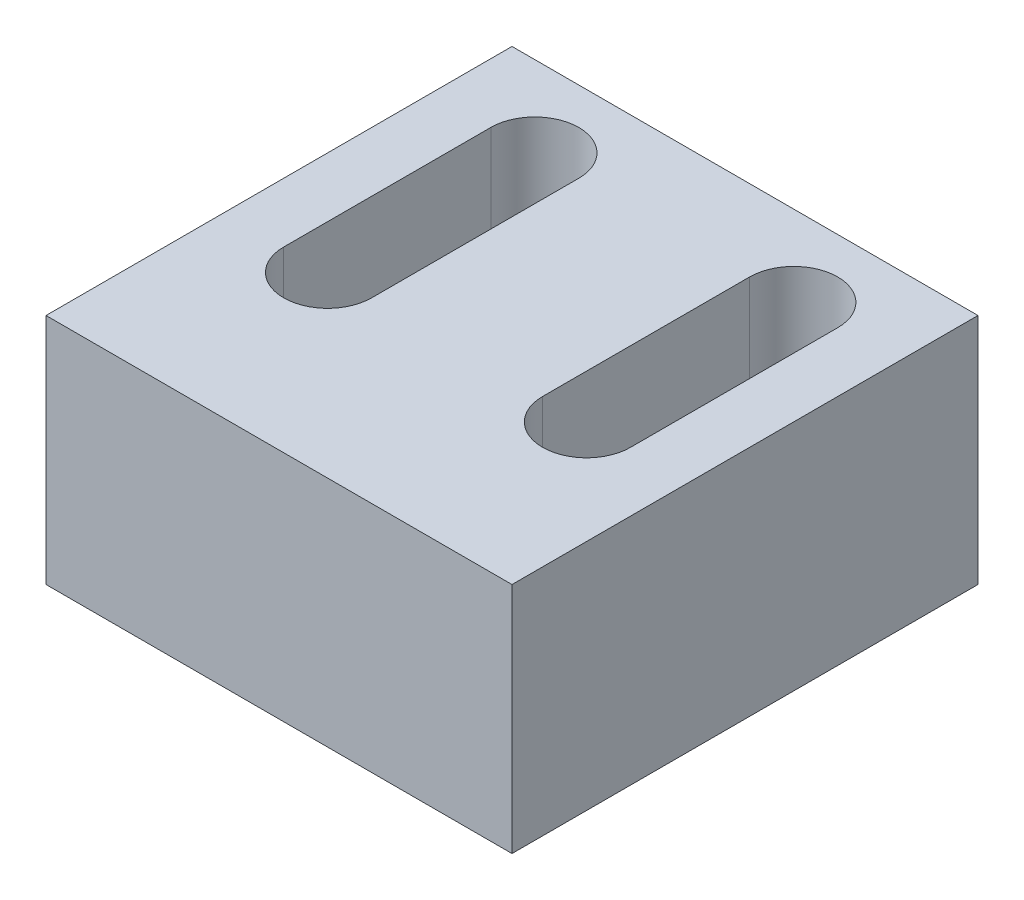
ISO-10303-21;
HEADER;
FILE_DESCRIPTION(('STEP AP214'),'2;1');
FILE_NAME('part.step','',(''),(''),'','','');
FILE_SCHEMA(('AUTOMOTIVE_DESIGN { 1 0 10303 214 1 1 1 1 }'));
ENDSEC;
DATA;
#1=APPLICATION_CONTEXT('core data for automotive mechanical design processes');
#2=APPLICATION_PROTOCOL_DEFINITION('international standard','automotive_design',2000,#1);
#3=PRODUCT_CONTEXT('',#1,'mechanical');
#4=PRODUCT('Part','Part','',(#3));
#5=PRODUCT_RELATED_PRODUCT_CATEGORY('part','',(#4));
#6=PRODUCT_DEFINITION_FORMATION('','',#4);
#7=PRODUCT_DEFINITION_CONTEXT('part definition',#1,'design');
#8=PRODUCT_DEFINITION('design','',#6,#7);
#9=PRODUCT_DEFINITION_SHAPE('','',#8);
#10=(LENGTH_UNIT() NAMED_UNIT(*) SI_UNIT(.MILLI.,.METRE.));
#11=(NAMED_UNIT(*) PLANE_ANGLE_UNIT() SI_UNIT($,.RADIAN.));
#12=(NAMED_UNIT(*) SI_UNIT($,.STERADIAN.) SOLID_ANGLE_UNIT());
#13=UNCERTAINTY_MEASURE_WITH_UNIT(LENGTH_MEASURE(1.E-05),#10,'distance_accuracy_value','');
#14=(GEOMETRIC_REPRESENTATION_CONTEXT(3) GLOBAL_UNCERTAINTY_ASSIGNED_CONTEXT((#13)) GLOBAL_UNIT_ASSIGNED_CONTEXT((#10,
#11,#12)) REPRESENTATION_CONTEXT('',''));
#15=CARTESIAN_POINT('',(0.,0.,0.));
#16=DIRECTION('',(0.,0.,1.));
#17=DIRECTION('',(1.,0.,0.));
#18=AXIS2_PLACEMENT_3D('',#15,#16,#17);
#19=CARTESIAN_POINT('',(22.5,11.25,-22.5));
#20=DIRECTION('',(0.,0.,1.));
#21=DIRECTION('',(0.,-1.,0.));
#22=AXIS2_PLACEMENT_3D('',#19,#20,#21);
#23=PLANE('',#22);
#24=DIRECTION('',(0.,1.,0.));
#25=VECTOR('',#24,1.);
#26=CARTESIAN_POINT('',(-22.5,11.25,-22.5));
#27=LINE('',#26,#25);
#28=CARTESIAN_POINT('',(-22.5,-11.25,-22.5));
#29=VERTEX_POINT('',#28);
#30=CARTESIAN_POINT('',(-22.5,11.25,-22.5));
#31=VERTEX_POINT('',#30);
#32=EDGE_CURVE('E163',#29,#31,#27,.T.);
#33=ORIENTED_EDGE('',*,*,#32,.T.);
#34=DIRECTION('',(-1.,0.,0.));
#35=VECTOR('',#34,1.);
#36=CARTESIAN_POINT('',(22.5,11.25,-22.5));
#37=LINE('',#36,#35);
#38=CARTESIAN_POINT('',(22.5,11.25,-22.5));
#39=VERTEX_POINT('',#38);
#40=EDGE_CURVE('E231',#39,#31,#37,.T.);
#41=ORIENTED_EDGE('',*,*,#40,.F.);
#42=DIRECTION('',(0.,1.,0.));
#43=VECTOR('',#42,1.);
#44=CARTESIAN_POINT('',(22.5,11.25,-22.5));
#45=LINE('',#44,#43);
#46=CARTESIAN_POINT('',(22.5,-11.25,-22.5));
#47=VERTEX_POINT('',#46);
#48=EDGE_CURVE('E194',#47,#39,#45,.T.);
#49=ORIENTED_EDGE('',*,*,#48,.F.);
#50=DIRECTION('',(-1.,0.,0.));
#51=VECTOR('',#50,1.);
#52=CARTESIAN_POINT('',(22.5,-11.25,-22.5));
#53=LINE('',#52,#51);
#54=EDGE_CURVE('E208',#47,#29,#53,.T.);
#55=ORIENTED_EDGE('',*,*,#54,.T.);
#56=EDGE_LOOP('',(#33,#41,#49,#55));
#57=FACE_BOUND('',#56,.T.);
#58=ADVANCED_FACE('F38',(#57),#23,.F.);
#59=CARTESIAN_POINT('',(22.5,11.25,22.5));
#60=DIRECTION('',(0.,-1.,0.));
#61=DIRECTION('',(0.,0.,-1.));
#62=AXIS2_PLACEMENT_3D('',#59,#60,#61);
#63=PLANE('',#62);
#64=DIRECTION('',(0.,0.,1.));
#65=VECTOR('',#64,1.);
#66=CARTESIAN_POINT('',(-16.75,11.25,-14.7));
#67=LINE('',#66,#65);
#68=CARTESIAN_POINT('',(-16.75,11.25,-14.7));
#69=VERTEX_POINT('',#68);
#70=CARTESIAN_POINT('',(-16.75,11.25,5.3));
#71=VERTEX_POINT('',#70);
#72=EDGE_CURVE('E145',#69,#71,#67,.T.);
#73=ORIENTED_EDGE('',*,*,#72,.F.);
#74=CARTESIAN_POINT('',(-12.5,11.25,-14.7));
#75=DIRECTION('',(0.,1.,0.));
#76=DIRECTION('',(0.,0.,1.));
#77=AXIS2_PLACEMENT_3D('',#74,#75,#76);
#78=CIRCLE('',#77,4.25);
#79=CARTESIAN_POINT('',(-8.25,11.25,-14.7));
#80=VERTEX_POINT('',#79);
#81=EDGE_CURVE('E53',#80,#69,#78,.T.);
#82=ORIENTED_EDGE('',*,*,#81,.F.);
#83=DIRECTION('',(0.,0.,-1.));
#84=VECTOR('',#83,1.);
#85=CARTESIAN_POINT('',(-8.25,11.25,-14.7));
#86=LINE('',#85,#84);
#87=CARTESIAN_POINT('',(-8.25,11.25,5.3));
#88=VERTEX_POINT('',#87);
#89=EDGE_CURVE('E153',#88,#80,#86,.T.);
#90=ORIENTED_EDGE('',*,*,#89,.F.);
#91=CARTESIAN_POINT('',(-12.5,11.25,5.3));
#92=DIRECTION('',(0.,1.,0.));
#93=DIRECTION('',(0.,0.,1.));
#94=AXIS2_PLACEMENT_3D('',#91,#92,#93);
#95=CIRCLE('',#94,4.25);
#96=EDGE_CURVE('E134',#71,#88,#95,.T.);
#97=ORIENTED_EDGE('',*,*,#96,.F.);
#98=EDGE_LOOP('',(#73,#82,#90,#97));
#99=FACE_BOUND('',#98,.T.);
#100=DIRECTION('',(0.,0.,1.));
#101=VECTOR('',#100,1.);
#102=CARTESIAN_POINT('',(8.25,11.25,-14.7));
#103=LINE('',#102,#101);
#104=CARTESIAN_POINT('',(8.25,11.25,-14.7));
#105=VERTEX_POINT('',#104);
#106=CARTESIAN_POINT('',(8.25,11.25,5.3));
#107=VERTEX_POINT('',#106);
#108=EDGE_CURVE('E170',#105,#107,#103,.T.);
#109=ORIENTED_EDGE('',*,*,#108,.F.);
#110=CARTESIAN_POINT('',(12.5,11.25,-14.7));
#111=DIRECTION('',(0.,1.,0.));
#112=DIRECTION('',(0.,0.,-1.));
#113=AXIS2_PLACEMENT_3D('',#110,#111,#112);
#114=CIRCLE('',#113,4.25);
#115=CARTESIAN_POINT('',(16.75,11.25,-14.7));
#116=VERTEX_POINT('',#115);
#117=EDGE_CURVE('E61',#116,#105,#114,.T.);
#118=ORIENTED_EDGE('',*,*,#117,.F.);
#119=DIRECTION('',(0.,0.,-1.));
#120=VECTOR('',#119,1.);
#121=CARTESIAN_POINT('',(16.75,11.25,-14.7));
#122=LINE('',#121,#120);
#123=CARTESIAN_POINT('',(16.75,11.25,5.3));
#124=VERTEX_POINT('',#123);
#125=EDGE_CURVE('E178',#124,#116,#122,.T.);
#126=ORIENTED_EDGE('',*,*,#125,.F.);
#127=CARTESIAN_POINT('',(12.5,11.25,5.3));
#128=DIRECTION('',(0.,1.,0.));
#129=DIRECTION('',(0.,0.,-1.));
#130=AXIS2_PLACEMENT_3D('',#127,#128,#129);
#131=CIRCLE('',#130,4.25);
#132=EDGE_CURVE('E174',#107,#124,#131,.T.);
#133=ORIENTED_EDGE('',*,*,#132,.F.);
#134=EDGE_LOOP('',(#109,#118,#126,#133));
#135=FACE_BOUND('',#134,.T.);
#136=DIRECTION('',(0.,0.,1.));
#137=VECTOR('',#136,1.);
#138=CARTESIAN_POINT('',(-22.5,11.25,22.5));
#139=LINE('',#138,#137);
#140=CARTESIAN_POINT('',(-22.5,11.25,22.5));
#141=VERTEX_POINT('',#140);
#142=EDGE_CURVE('E212',#31,#141,#139,.T.);
#143=ORIENTED_EDGE('',*,*,#142,.T.);
#144=DIRECTION('',(-1.,0.,0.));
#145=VECTOR('',#144,1.);
#146=CARTESIAN_POINT('',(22.5,11.25,22.5));
#147=LINE('',#146,#145);
#148=CARTESIAN_POINT('',(22.5,11.25,22.5));
#149=VERTEX_POINT('',#148);
#150=EDGE_CURVE('E227',#149,#141,#147,.T.);
#151=ORIENTED_EDGE('',*,*,#150,.F.);
#152=DIRECTION('',(0.,0.,1.));
#153=VECTOR('',#152,1.);
#154=CARTESIAN_POINT('',(22.5,11.25,22.5));
#155=LINE('',#154,#153);
#156=EDGE_CURVE('E198',#39,#149,#155,.T.);
#157=ORIENTED_EDGE('',*,*,#156,.F.);
#158=ORIENTED_EDGE('',*,*,#40,.T.);
#159=EDGE_LOOP('',(#143,#151,#157,#158));
#160=FACE_BOUND('',#159,.T.);
#161=ADVANCED_FACE('F150',(#99,#135,#160),#63,.F.);
#162=CARTESIAN_POINT('',(22.5,11.25,22.5));
#163=DIRECTION('',(0.,0.,-1.));
#164=DIRECTION('',(0.,1.,0.));
#165=AXIS2_PLACEMENT_3D('',#162,#163,#164);
#166=PLANE('',#165);
#167=DIRECTION('',(0.,-1.,0.));
#168=VECTOR('',#167,1.);
#169=CARTESIAN_POINT('',(-22.5,11.25,22.5));
#170=LINE('',#169,#168);
#171=CARTESIAN_POINT('',(-22.5,-11.25,22.5));
#172=VERTEX_POINT('',#171);
#173=EDGE_CURVE('E215',#141,#172,#170,.T.);
#174=ORIENTED_EDGE('',*,*,#173,.T.);
#175=DIRECTION('',(-1.,0.,0.));
#176=VECTOR('',#175,1.);
#177=CARTESIAN_POINT('',(22.5,-11.25,22.5));
#178=LINE('',#177,#176);
#179=CARTESIAN_POINT('',(22.5,-11.25,22.5));
#180=VERTEX_POINT('',#179);
#181=EDGE_CURVE('E223',#180,#172,#178,.T.);
#182=ORIENTED_EDGE('',*,*,#181,.F.);
#183=DIRECTION('',(0.,-1.,0.));
#184=VECTOR('',#183,1.);
#185=CARTESIAN_POINT('',(22.5,11.25,22.5));
#186=LINE('',#185,#184);
#187=EDGE_CURVE('E202',#149,#180,#186,.T.);
#188=ORIENTED_EDGE('',*,*,#187,.F.);
#189=ORIENTED_EDGE('',*,*,#150,.T.);
#190=EDGE_LOOP('',(#174,#182,#188,#189));
#191=FACE_BOUND('',#190,.T.);
#192=ADVANCED_FACE('F282',(#191),#166,.F.);
#193=CARTESIAN_POINT('',(22.5,-11.25,22.5));
#194=DIRECTION('',(0.,1.,0.));
#195=DIRECTION('',(0.,0.,1.));
#196=AXIS2_PLACEMENT_3D('',#193,#194,#195);
#197=PLANE('',#196);
#198=DIRECTION('',(0.,0.,-1.));
#199=VECTOR('',#198,1.);
#200=CARTESIAN_POINT('',(-8.25,-11.25,22.5));
#201=LINE('',#200,#199);
#202=CARTESIAN_POINT('',(-8.25,-11.25,5.3));
#203=VERTEX_POINT('',#202);
#204=CARTESIAN_POINT('',(-8.25,-11.25,-14.7));
#205=VERTEX_POINT('',#204);
#206=EDGE_CURVE('E46',#203,#205,#201,.T.);
#207=ORIENTED_EDGE('',*,*,#206,.T.);
#208=CARTESIAN_POINT('',(-12.5,-11.25,-14.7));
#209=DIRECTION('',(0.,1.,0.));
#210=DIRECTION('',(0.,0.,1.));
#211=AXIS2_PLACEMENT_3D('',#208,#209,#210);
#212=CIRCLE('',#211,4.25);
#213=CARTESIAN_POINT('',(-16.75,-11.25,-14.7));
#214=VERTEX_POINT('',#213);
#215=EDGE_CURVE('E11',#205,#214,#212,.T.);
#216=ORIENTED_EDGE('',*,*,#215,.T.);
#217=DIRECTION('',(0.,0.,1.));
#218=VECTOR('',#217,1.);
#219=CARTESIAN_POINT('',(-16.75,-11.25,22.5));
#220=LINE('',#219,#218);
#221=CARTESIAN_POINT('',(-16.75,-11.25,5.3));
#222=VERTEX_POINT('',#221);
#223=EDGE_CURVE('E251',#214,#222,#220,.T.);
#224=ORIENTED_EDGE('',*,*,#223,.T.);
#225=CARTESIAN_POINT('',(-12.5,-11.25,5.3));
#226=DIRECTION('',(0.,1.,0.));
#227=DIRECTION('',(0.,0.,1.));
#228=AXIS2_PLACEMENT_3D('',#225,#226,#227);
#229=CIRCLE('',#228,4.25);
#230=EDGE_CURVE('E137',#222,#203,#229,.T.);
#231=ORIENTED_EDGE('',*,*,#230,.T.);
#232=EDGE_LOOP('',(#207,#216,#224,#231));
#233=FACE_BOUND('',#232,.T.);
#234=DIRECTION('',(0.,0.,-1.));
#235=VECTOR('',#234,1.);
#236=CARTESIAN_POINT('',(16.75,-11.25,22.5));
#237=LINE('',#236,#235);
#238=CARTESIAN_POINT('',(16.75,-11.25,5.3));
#239=VERTEX_POINT('',#238);
#240=CARTESIAN_POINT('',(16.75,-11.25,-14.7));
#241=VERTEX_POINT('',#240);
#242=EDGE_CURVE('E243',#239,#241,#237,.T.);
#243=ORIENTED_EDGE('',*,*,#242,.T.);
#244=CARTESIAN_POINT('',(12.5,-11.25,-14.7));
#245=DIRECTION('',(0.,1.,0.));
#246=DIRECTION('',(0.,0.,1.));
#247=AXIS2_PLACEMENT_3D('',#244,#245,#246);
#248=CIRCLE('',#247,4.25);
#249=CARTESIAN_POINT('',(8.25,-11.25,-14.7));
#250=VERTEX_POINT('',#249);
#251=EDGE_CURVE('E247',#241,#250,#248,.T.);
#252=ORIENTED_EDGE('',*,*,#251,.T.);
#253=DIRECTION('',(0.,0.,1.));
#254=VECTOR('',#253,1.);
#255=CARTESIAN_POINT('',(8.25000000000001,-11.25,22.5));
#256=LINE('',#255,#254);
#257=CARTESIAN_POINT('',(8.25,-11.25,5.3));
#258=VERTEX_POINT('',#257);
#259=EDGE_CURVE('E235',#250,#258,#256,.T.);
#260=ORIENTED_EDGE('',*,*,#259,.T.);
#261=CARTESIAN_POINT('',(12.5,-11.25,5.3));
#262=DIRECTION('',(0.,1.,0.));
#263=DIRECTION('',(0.,0.,1.));
#264=AXIS2_PLACEMENT_3D('',#261,#262,#263);
#265=CIRCLE('',#264,4.25);
#266=EDGE_CURVE('E239',#258,#239,#265,.T.);
#267=ORIENTED_EDGE('',*,*,#266,.T.);
#268=EDGE_LOOP('',(#243,#252,#260,#267));
#269=FACE_BOUND('',#268,.T.);
#270=DIRECTION('',(0.,0.,-1.));
#271=VECTOR('',#270,1.);
#272=CARTESIAN_POINT('',(-22.5,-11.25,22.5));
#273=LINE('',#272,#271);
#274=EDGE_CURVE('E199',#172,#29,#273,.T.);
#275=ORIENTED_EDGE('',*,*,#274,.T.);
#276=ORIENTED_EDGE('',*,*,#54,.F.);
#277=DIRECTION('',(0.,0.,-1.));
#278=VECTOR('',#277,1.);
#279=CARTESIAN_POINT('',(22.5,-11.25,22.5));
#280=LINE('',#279,#278);
#281=EDGE_CURVE('E205',#180,#47,#280,.T.);
#282=ORIENTED_EDGE('',*,*,#281,.F.);
#283=ORIENTED_EDGE('',*,*,#181,.T.);
#284=EDGE_LOOP('',(#275,#276,#282,#283));
#285=FACE_BOUND('',#284,.T.);
#286=ADVANCED_FACE('F258',(#233,#269,#285),#197,.F.);
#287=CARTESIAN_POINT('',(22.5,0.,0.));
#288=DIRECTION('',(1.,0.,0.));
#289=DIRECTION('',(0.,0.,-1.));
#290=AXIS2_PLACEMENT_3D('',#287,#288,#289);
#291=PLANE('',#290);
#292=ORIENTED_EDGE('',*,*,#48,.T.);
#293=ORIENTED_EDGE('',*,*,#156,.T.);
#294=ORIENTED_EDGE('',*,*,#187,.T.);
#295=ORIENTED_EDGE('',*,*,#281,.T.);
#296=EDGE_LOOP('',(#292,#293,#294,#295));
#297=FACE_BOUND('',#296,.T.);
#298=ADVANCED_FACE('F295',(#297),#291,.T.);
#299=CARTESIAN_POINT('',(-22.5,0.,0.));
#300=DIRECTION('',(1.,0.,0.));
#301=DIRECTION('',(0.,0.,-1.));
#302=AXIS2_PLACEMENT_3D('',#299,#300,#301);
#303=PLANE('',#302);
#304=ORIENTED_EDGE('',*,*,#32,.F.);
#305=ORIENTED_EDGE('',*,*,#274,.F.);
#306=ORIENTED_EDGE('',*,*,#173,.F.);
#307=ORIENTED_EDGE('',*,*,#142,.F.);
#308=EDGE_LOOP('',(#304,#305,#306,#307));
#309=FACE_BOUND('',#308,.T.);
#310=ADVANCED_FACE('F289',(#309),#303,.F.);
#311=CARTESIAN_POINT('',(12.5,-33.75,-14.7));
#312=DIRECTION('',(0.,1.,0.));
#313=DIRECTION('',(0.,0.,1.));
#314=AXIS2_PLACEMENT_3D('',#311,#312,#313);
#315=CYLINDRICAL_SURFACE('',#314,4.25);
#316=DIRECTION('',(0.,1.,0.));
#317=VECTOR('',#316,1.);
#318=CARTESIAN_POINT('',(16.75,-33.75,-14.7));
#319=LINE('',#318,#317);
#320=EDGE_CURVE('E183',#241,#116,#319,.T.);
#321=ORIENTED_EDGE('',*,*,#320,.T.);
#322=ORIENTED_EDGE('',*,*,#117,.T.);
#323=DIRECTION('',(0.,1.,0.));
#324=VECTOR('',#323,1.);
#325=CARTESIAN_POINT('',(8.25,-33.75,-14.7));
#326=LINE('',#325,#324);
#327=EDGE_CURVE('E182',#250,#105,#326,.T.);
#328=ORIENTED_EDGE('',*,*,#327,.F.);
#329=ORIENTED_EDGE('',*,*,#251,.F.);
#330=EDGE_LOOP('',(#321,#322,#328,#329));
#331=FACE_BOUND('',#330,.T.);
#332=ADVANCED_FACE('F309',(#331),#315,.F.);
#333=CARTESIAN_POINT('',(16.75,-33.75,-14.7));
#334=DIRECTION('',(1.,0.,0.));
#335=DIRECTION('',(0.,0.,-1.));
#336=AXIS2_PLACEMENT_3D('',#333,#334,#335);
#337=PLANE('',#336);
#338=DIRECTION('',(0.,1.,0.));
#339=VECTOR('',#338,1.);
#340=CARTESIAN_POINT('',(16.75,-33.75,5.3));
#341=LINE('',#340,#339);
#342=EDGE_CURVE('E186',#239,#124,#341,.T.);
#343=ORIENTED_EDGE('',*,*,#342,.T.);
#344=ORIENTED_EDGE('',*,*,#125,.T.);
#345=ORIENTED_EDGE('',*,*,#320,.F.);
#346=ORIENTED_EDGE('',*,*,#242,.F.);
#347=EDGE_LOOP('',(#343,#344,#345,#346));
#348=FACE_BOUND('',#347,.T.);
#349=ADVANCED_FACE('F313',(#348),#337,.F.);
#350=CARTESIAN_POINT('',(12.5,-33.75,5.3));
#351=DIRECTION('',(0.,1.,0.));
#352=DIRECTION('',(0.,0.,1.));
#353=AXIS2_PLACEMENT_3D('',#350,#351,#352);
#354=CYLINDRICAL_SURFACE('',#353,4.25);
#355=DIRECTION('',(0.,1.,0.));
#356=VECTOR('',#355,1.);
#357=CARTESIAN_POINT('',(8.25,-33.75,5.3));
#358=LINE('',#357,#356);
#359=EDGE_CURVE('E189',#258,#107,#358,.T.);
#360=ORIENTED_EDGE('',*,*,#359,.T.);
#361=ORIENTED_EDGE('',*,*,#132,.T.);
#362=ORIENTED_EDGE('',*,*,#342,.F.);
#363=ORIENTED_EDGE('',*,*,#266,.F.);
#364=EDGE_LOOP('',(#360,#361,#362,#363));
#365=FACE_BOUND('',#364,.T.);
#366=ADVANCED_FACE('F272',(#365),#354,.F.);
#367=CARTESIAN_POINT('',(8.25,-33.75,-14.7));
#368=DIRECTION('',(-1.,0.,0.));
#369=DIRECTION('',(0.,0.,1.));
#370=AXIS2_PLACEMENT_3D('',#367,#368,#369);
#371=PLANE('',#370);
#372=ORIENTED_EDGE('',*,*,#327,.T.);
#373=ORIENTED_EDGE('',*,*,#108,.T.);
#374=ORIENTED_EDGE('',*,*,#359,.F.);
#375=ORIENTED_EDGE('',*,*,#259,.F.);
#376=EDGE_LOOP('',(#372,#373,#374,#375));
#377=FACE_BOUND('',#376,.T.);
#378=ADVANCED_FACE('F265',(#377),#371,.F.);
#379=CARTESIAN_POINT('',(-12.5,-33.75,-14.7));
#380=DIRECTION('',(0.,1.,0.));
#381=DIRECTION('',(0.,0.,1.));
#382=AXIS2_PLACEMENT_3D('',#379,#380,#381);
#383=CYLINDRICAL_SURFACE('',#382,4.25);
#384=DIRECTION('',(0.,1.,0.));
#385=VECTOR('',#384,1.);
#386=CARTESIAN_POINT('',(-8.25,-33.75,-14.7));
#387=LINE('',#386,#385);
#388=EDGE_CURVE('E160',#205,#80,#387,.T.);
#389=ORIENTED_EDGE('',*,*,#388,.T.);
#390=ORIENTED_EDGE('',*,*,#81,.T.);
#391=DIRECTION('',(0.,1.,0.));
#392=VECTOR('',#391,1.);
#393=CARTESIAN_POINT('',(-16.75,-33.75,-14.7));
#394=LINE('',#393,#392);
#395=EDGE_CURVE('E142',#214,#69,#394,.T.);
#396=ORIENTED_EDGE('',*,*,#395,.F.);
#397=ORIENTED_EDGE('',*,*,#215,.F.);
#398=EDGE_LOOP('',(#389,#390,#396,#397));
#399=FACE_BOUND('',#398,.T.);
#400=ADVANCED_FACE('F263',(#399),#383,.F.);
#401=CARTESIAN_POINT('',(-8.25,-33.75,-14.7));
#402=DIRECTION('',(1.,0.,0.));
#403=DIRECTION('',(0.,0.,-1.));
#404=AXIS2_PLACEMENT_3D('',#401,#402,#403);
#405=PLANE('',#404);
#406=DIRECTION('',(0.,1.,0.));
#407=VECTOR('',#406,1.);
#408=CARTESIAN_POINT('',(-8.25,-33.75,5.3));
#409=LINE('',#408,#407);
#410=EDGE_CURVE('E141',#203,#88,#409,.T.);
#411=ORIENTED_EDGE('',*,*,#410,.T.);
#412=ORIENTED_EDGE('',*,*,#89,.T.);
#413=ORIENTED_EDGE('',*,*,#388,.F.);
#414=ORIENTED_EDGE('',*,*,#206,.F.);
#415=EDGE_LOOP('',(#411,#412,#413,#414));
#416=FACE_BOUND('',#415,.T.);
#417=ADVANCED_FACE('F262',(#416),#405,.F.);
#418=CARTESIAN_POINT('',(-12.5,-33.75,5.3));
#419=DIRECTION('',(0.,1.,0.));
#420=DIRECTION('',(0.,0.,1.));
#421=AXIS2_PLACEMENT_3D('',#418,#419,#420);
#422=CYLINDRICAL_SURFACE('',#421,4.25);
#423=DIRECTION('',(0.,1.,0.));
#424=VECTOR('',#423,1.);
#425=CARTESIAN_POINT('',(-16.75,-33.75,5.3));
#426=LINE('',#425,#424);
#427=EDGE_CURVE('E129',#222,#71,#426,.T.);
#428=ORIENTED_EDGE('',*,*,#427,.T.);
#429=ORIENTED_EDGE('',*,*,#96,.T.);
#430=ORIENTED_EDGE('',*,*,#410,.F.);
#431=ORIENTED_EDGE('',*,*,#230,.F.);
#432=EDGE_LOOP('',(#428,#429,#430,#431));
#433=FACE_BOUND('',#432,.T.);
#434=ADVANCED_FACE('F131',(#433),#422,.F.);
#435=CARTESIAN_POINT('',(-16.75,-33.75,-14.7));
#436=DIRECTION('',(-1.,0.,0.));
#437=DIRECTION('',(0.,0.,1.));
#438=AXIS2_PLACEMENT_3D('',#435,#436,#437);
#439=PLANE('',#438);
#440=ORIENTED_EDGE('',*,*,#395,.T.);
#441=ORIENTED_EDGE('',*,*,#72,.T.);
#442=ORIENTED_EDGE('',*,*,#427,.F.);
#443=ORIENTED_EDGE('',*,*,#223,.F.);
#444=EDGE_LOOP('',(#440,#441,#442,#443));
#445=FACE_BOUND('',#444,.T.);
#446=ADVANCED_FACE('F146',(#445),#439,.F.);
#447=CLOSED_SHELL('',(#58,#161,#192,#286,#298,#310,#332,#349,#366,#378,#400,#417,#434,#446));
#448=MANIFOLD_SOLID_BREP('B2',#447);
#449=ADVANCED_BREP_SHAPE_REPRESENTATION('',(#18,#448),#14);
#450=SHAPE_DEFINITION_REPRESENTATION(#9,#449);
ENDSEC;
END-ISO-10303-21;
